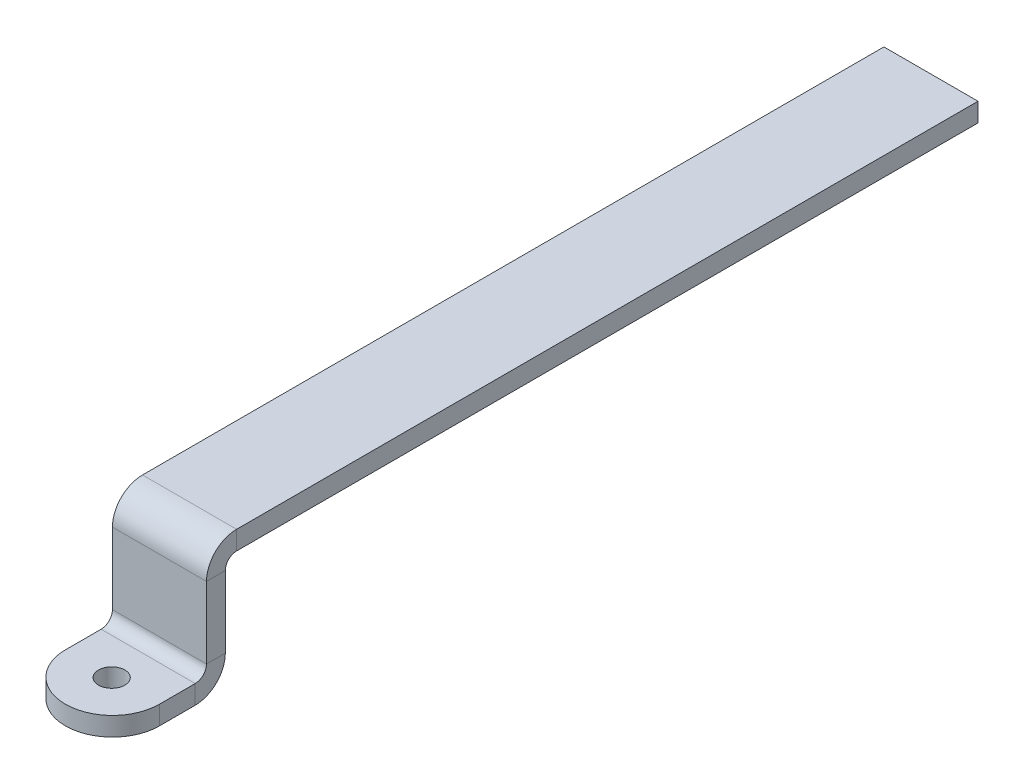
ISO-10303-21;
HEADER;
FILE_DESCRIPTION(('STEP AP214'),'2;1');
FILE_NAME('part.step','',(''),(''),'','','');
FILE_SCHEMA(('AUTOMOTIVE_DESIGN { 1 0 10303 214 1 1 1 1 }'));
ENDSEC;
DATA;
#1=APPLICATION_CONTEXT('core data for automotive mechanical design processes');
#2=APPLICATION_PROTOCOL_DEFINITION('international standard','automotive_design',2000,#1);
#3=PRODUCT_CONTEXT('',#1,'mechanical');
#4=PRODUCT('Part','Part','',(#3));
#5=PRODUCT_RELATED_PRODUCT_CATEGORY('part','',(#4));
#6=PRODUCT_DEFINITION_FORMATION('','',#4);
#7=PRODUCT_DEFINITION_CONTEXT('part definition',#1,'design');
#8=PRODUCT_DEFINITION('design','',#6,#7);
#9=PRODUCT_DEFINITION_SHAPE('','',#8);
#10=(LENGTH_UNIT() NAMED_UNIT(*) SI_UNIT(.MILLI.,.METRE.));
#11=(NAMED_UNIT(*) PLANE_ANGLE_UNIT() SI_UNIT($,.RADIAN.));
#12=(NAMED_UNIT(*) SI_UNIT($,.STERADIAN.) SOLID_ANGLE_UNIT());
#13=UNCERTAINTY_MEASURE_WITH_UNIT(LENGTH_MEASURE(1.E-05),#10,'distance_accuracy_value','');
#14=(GEOMETRIC_REPRESENTATION_CONTEXT(3) GLOBAL_UNCERTAINTY_ASSIGNED_CONTEXT((#13)) GLOBAL_UNIT_ASSIGNED_CONTEXT((#10,
#11,#12)) REPRESENTATION_CONTEXT('',''));
#15=CARTESIAN_POINT('',(0.,0.,0.));
#16=DIRECTION('',(0.,0.,1.));
#17=DIRECTION('',(1.,0.,0.));
#18=AXIS2_PLACEMENT_3D('',#15,#16,#17);
#19=CARTESIAN_POINT('',(0.,-1.25,0.875));
#20=DIRECTION('',(0.,1.,0.));
#21=DIRECTION('',(0.,0.,1.));
#22=AXIS2_PLACEMENT_3D('',#19,#20,#21);
#23=CYLINDRICAL_SURFACE('',#22,0.625);
#24=DIRECTION('',(0.,1.,0.));
#25=VECTOR('',#24,1.);
#26=CARTESIAN_POINT('',(0.625,-1.1,0.875));
#27=LINE('',#26,#25);
#28=CARTESIAN_POINT('',(0.625,-1.25,0.875));
#29=VERTEX_POINT('',#28);
#30=CARTESIAN_POINT('',(0.625,-1.5,0.875));
#31=VERTEX_POINT('',#30);
#32=EDGE_CURVE('E154',#29,#31,#27,.F.);
#33=ORIENTED_EDGE('',*,*,#32,.F.);
#34=CARTESIAN_POINT('',(0.,-1.25,0.875));
#35=DIRECTION('',(0.,-1.,0.));
#36=DIRECTION('',(0.,0.,-1.));
#37=AXIS2_PLACEMENT_3D('',#34,#35,#36);
#38=CIRCLE('',#37,0.625);
#39=CARTESIAN_POINT('',(-0.625,-1.25,0.875));
#40=VERTEX_POINT('',#39);
#41=EDGE_CURVE('E46',#40,#29,#38,.F.);
#42=ORIENTED_EDGE('',*,*,#41,.F.);
#43=DIRECTION('',(0.,-1.,0.));
#44=VECTOR('',#43,1.);
#45=CARTESIAN_POINT('',(-0.625,-1.25,0.875));
#46=LINE('',#45,#44);
#47=CARTESIAN_POINT('',(-0.625,-1.5,0.875));
#48=VERTEX_POINT('',#47);
#49=EDGE_CURVE('E250',#48,#40,#46,.F.);
#50=ORIENTED_EDGE('',*,*,#49,.F.);
#51=CARTESIAN_POINT('',(0.,-1.5,0.875));
#52=DIRECTION('',(0.,-1.,0.));
#53=DIRECTION('',(0.,0.,-1.));
#54=AXIS2_PLACEMENT_3D('',#51,#52,#53);
#55=CIRCLE('',#54,0.625);
#56=EDGE_CURVE('E11',#31,#48,#55,.T.);
#57=ORIENTED_EDGE('',*,*,#56,.F.);
#58=EDGE_LOOP('',(#33,#42,#50,#57));
#59=FACE_BOUND('',#58,.T.);
#60=ADVANCED_FACE('F38',(#59),#23,.T.);
#61=CARTESIAN_POINT('',(0.625,-0.15,0.));
#62=DIRECTION('',(1.,0.,0.));
#63=DIRECTION('',(0.,0.,-1.));
#64=AXIS2_PLACEMENT_3D('',#61,#62,#63);
#65=PLANE('',#64);
#66=DIRECTION('',(0.,0.,1.));
#67=VECTOR('',#66,1.);
#68=CARTESIAN_POINT('',(0.625,-0.15,0.));
#69=LINE('',#68,#67);
#70=CARTESIAN_POINT('',(0.625,-0.15,0.));
#71=VERTEX_POINT('',#70);
#72=CARTESIAN_POINT('',(0.625,-0.15,0.25));
#73=VERTEX_POINT('',#72);
#74=EDGE_CURVE('E247',#71,#73,#69,.T.);
#75=ORIENTED_EDGE('',*,*,#74,.F.);
#76=CARTESIAN_POINT('',(0.625,-0.15,-0.15));
#77=DIRECTION('',(-1.,0.,0.));
#78=DIRECTION('',(0.,0.,1.));
#79=AXIS2_PLACEMENT_3D('',#76,#77,#78);
#80=CIRCLE('',#79,0.15);
#81=CARTESIAN_POINT('',(0.625,0.,-0.150000000000001));
#82=VERTEX_POINT('',#81);
#83=EDGE_CURVE('E162',#82,#71,#80,.F.);
#84=ORIENTED_EDGE('',*,*,#83,.F.);
#85=DIRECTION('',(0.,-1.,0.));
#86=VECTOR('',#85,1.);
#87=CARTESIAN_POINT('',(0.625,0.25,-0.150000000000001));
#88=LINE('',#87,#86);
#89=CARTESIAN_POINT('',(0.625,0.25,-0.150000000000001));
#90=VERTEX_POINT('',#89);
#91=EDGE_CURVE('E245',#90,#82,#88,.T.);
#92=ORIENTED_EDGE('',*,*,#91,.F.);
#93=CARTESIAN_POINT('',(0.625,-0.15,-0.15));
#94=DIRECTION('',(1.,0.,0.));
#95=DIRECTION('',(0.,0.,-1.));
#96=AXIS2_PLACEMENT_3D('',#93,#94,#95);
#97=CIRCLE('',#96,0.4);
#98=EDGE_CURVE('E177',#90,#73,#97,.T.);
#99=ORIENTED_EDGE('',*,*,#98,.T.);
#100=EDGE_LOOP('',(#75,#84,#92,#99));
#101=FACE_BOUND('',#100,.T.);
#102=ADVANCED_FACE('F282',(#101),#65,.T.);
#103=CARTESIAN_POINT('',(0.625,0.25,-0.150000000000001));
#104=DIRECTION('',(1.,0.,0.));
#105=DIRECTION('',(0.,0.,-1.));
#106=AXIS2_PLACEMENT_3D('',#103,#104,#105);
#107=PLANE('',#106);
#108=DIRECTION('',(0.,-1.,0.));
#109=VECTOR('',#108,1.);
#110=CARTESIAN_POINT('',(0.625,0.,0.));
#111=LINE('',#110,#109);
#112=CARTESIAN_POINT('',(0.625,-1.1,0.));
#113=VERTEX_POINT('',#112);
#114=EDGE_CURVE('E160',#71,#113,#111,.T.);
#115=ORIENTED_EDGE('',*,*,#114,.F.);
#116=ORIENTED_EDGE('',*,*,#74,.T.);
#117=DIRECTION('',(0.,-1.,0.));
#118=VECTOR('',#117,1.);
#119=CARTESIAN_POINT('',(0.625,0.,0.25));
#120=LINE('',#119,#118);
#121=CARTESIAN_POINT('',(0.625,-1.1,0.25));
#122=VERTEX_POINT('',#121);
#123=EDGE_CURVE('E180',#73,#122,#120,.T.);
#124=ORIENTED_EDGE('',*,*,#123,.T.);
#125=DIRECTION('',(0.,0.,-1.));
#126=VECTOR('',#125,1.);
#127=CARTESIAN_POINT('',(0.625,-1.1,0.25));
#128=LINE('',#127,#126);
#129=EDGE_CURVE('E138',#122,#113,#128,.T.);
#130=ORIENTED_EDGE('',*,*,#129,.T.);
#131=EDGE_LOOP('',(#115,#116,#124,#130));
#132=FACE_BOUND('',#131,.T.);
#133=ADVANCED_FACE('F286',(#132),#107,.T.);
#134=CARTESIAN_POINT('',(-0.625,0.,-0.150000000000001));
#135=DIRECTION('',(-1.,0.,0.));
#136=DIRECTION('',(0.,0.,1.));
#137=AXIS2_PLACEMENT_3D('',#134,#135,#136);
#138=PLANE('',#137);
#139=DIRECTION('',(0.,1.,0.));
#140=VECTOR('',#139,1.);
#141=CARTESIAN_POINT('',(-0.625,0.,-0.150000000000001));
#142=LINE('',#141,#140);
#143=CARTESIAN_POINT('',(-0.625,0.,-0.150000000000001));
#144=VERTEX_POINT('',#143);
#145=CARTESIAN_POINT('',(-0.625,0.25,-0.150000000000001));
#146=VERTEX_POINT('',#145);
#147=EDGE_CURVE('E243',#144,#146,#142,.T.);
#148=ORIENTED_EDGE('',*,*,#147,.F.);
#149=CARTESIAN_POINT('',(-0.625,-0.15,-0.15));
#150=DIRECTION('',(-1.,0.,0.));
#151=DIRECTION('',(0.,0.,1.));
#152=AXIS2_PLACEMENT_3D('',#149,#150,#151);
#153=CIRCLE('',#152,0.15);
#154=CARTESIAN_POINT('',(-0.625,-0.15,0.));
#155=VERTEX_POINT('',#154);
#156=EDGE_CURVE('E195',#144,#155,#153,.F.);
#157=ORIENTED_EDGE('',*,*,#156,.T.);
#158=DIRECTION('',(0.,0.,-1.));
#159=VECTOR('',#158,1.);
#160=CARTESIAN_POINT('',(-0.625,-0.15,0.25));
#161=LINE('',#160,#159);
#162=CARTESIAN_POINT('',(-0.625,-0.15,0.25));
#163=VERTEX_POINT('',#162);
#164=EDGE_CURVE('E137',#163,#155,#161,.T.);
#165=ORIENTED_EDGE('',*,*,#164,.F.);
#166=CARTESIAN_POINT('',(-0.625,-0.15,-0.15));
#167=DIRECTION('',(1.,0.,0.));
#168=DIRECTION('',(0.,0.,-1.));
#169=AXIS2_PLACEMENT_3D('',#166,#167,#168);
#170=CIRCLE('',#169,0.4);
#171=EDGE_CURVE('E207',#146,#163,#170,.T.);
#172=ORIENTED_EDGE('',*,*,#171,.F.);
#173=EDGE_LOOP('',(#148,#157,#165,#172));
#174=FACE_BOUND('',#173,.T.);
#175=ADVANCED_FACE('F291',(#174),#138,.T.);
#176=CARTESIAN_POINT('',(-0.625,-0.15,0.25));
#177=DIRECTION('',(-1.,0.,0.));
#178=DIRECTION('',(0.,0.,1.));
#179=AXIS2_PLACEMENT_3D('',#176,#177,#178);
#180=PLANE('',#179);
#181=DIRECTION('',(0.,0.,1.));
#182=VECTOR('',#181,1.);
#183=CARTESIAN_POINT('',(-0.625,0.,-10.));
#184=LINE('',#183,#182);
#185=CARTESIAN_POINT('',(-0.625,0.,-10.));
#186=VERTEX_POINT('',#185);
#187=EDGE_CURVE('E198',#186,#144,#184,.T.);
#188=ORIENTED_EDGE('',*,*,#187,.T.);
#189=ORIENTED_EDGE('',*,*,#147,.T.);
#190=DIRECTION('',(0.,0.,1.));
#191=VECTOR('',#190,1.);
#192=CARTESIAN_POINT('',(-0.625,0.25,-10.));
#193=LINE('',#192,#191);
#194=CARTESIAN_POINT('',(-0.625,0.25,-10.));
#195=VERTEX_POINT('',#194);
#196=EDGE_CURVE('E204',#195,#146,#193,.T.);
#197=ORIENTED_EDGE('',*,*,#196,.F.);
#198=DIRECTION('',(0.,-1.,0.));
#199=VECTOR('',#198,1.);
#200=CARTESIAN_POINT('',(-0.625,0.25,-10.));
#201=LINE('',#200,#199);
#202=EDGE_CURVE('E201',#195,#186,#201,.T.);
#203=ORIENTED_EDGE('',*,*,#202,.T.);
#204=EDGE_LOOP('',(#188,#189,#197,#203));
#205=FACE_BOUND('',#204,.T.);
#206=ADVANCED_FACE('F297',(#205),#180,.T.);
#207=CARTESIAN_POINT('',(0.625,-1.5,0.4));
#208=DIRECTION('',(1.,0.,0.));
#209=DIRECTION('',(0.,0.,-1.));
#210=AXIS2_PLACEMENT_3D('',#207,#208,#209);
#211=PLANE('',#210);
#212=DIRECTION('',(0.,1.,0.));
#213=VECTOR('',#212,1.);
#214=CARTESIAN_POINT('',(0.625,-1.5,0.4));
#215=LINE('',#214,#213);
#216=CARTESIAN_POINT('',(0.625,-1.5,0.4));
#217=VERTEX_POINT('',#216);
#218=CARTESIAN_POINT('',(0.625,-1.25,0.4));
#219=VERTEX_POINT('',#218);
#220=EDGE_CURVE('E125',#217,#219,#215,.T.);
#221=ORIENTED_EDGE('',*,*,#220,.F.);
#222=CARTESIAN_POINT('',(0.625,-1.1,0.4));
#223=DIRECTION('',(1.,0.,0.));
#224=DIRECTION('',(0.,0.,-1.));
#225=AXIS2_PLACEMENT_3D('',#222,#223,#224);
#226=CIRCLE('',#225,0.4);
#227=EDGE_CURVE('E129',#113,#217,#226,.F.);
#228=ORIENTED_EDGE('',*,*,#227,.F.);
#229=ORIENTED_EDGE('',*,*,#129,.F.);
#230=CARTESIAN_POINT('',(0.625,-1.1,0.4));
#231=DIRECTION('',(1.,0.,0.));
#232=DIRECTION('',(0.,0.,-1.));
#233=AXIS2_PLACEMENT_3D('',#230,#231,#232);
#234=CIRCLE('',#233,0.15);
#235=EDGE_CURVE('E132',#122,#219,#234,.F.);
#236=ORIENTED_EDGE('',*,*,#235,.T.);
#237=EDGE_LOOP('',(#221,#228,#229,#236));
#238=FACE_BOUND('',#237,.T.);
#239=ADVANCED_FACE('F127',(#238),#211,.T.);
#240=CARTESIAN_POINT('',(0.625,-1.1,0.25));
#241=DIRECTION('',(1.,0.,0.));
#242=DIRECTION('',(0.,0.,-1.));
#243=AXIS2_PLACEMENT_3D('',#240,#241,#242);
#244=PLANE('',#243);
#245=DIRECTION('',(0.,0.,1.));
#246=VECTOR('',#245,1.);
#247=CARTESIAN_POINT('',(0.625,-1.25,0.));
#248=LINE('',#247,#246);
#249=EDGE_CURVE('E155',#219,#29,#248,.T.);
#250=ORIENTED_EDGE('',*,*,#249,.T.);
#251=ORIENTED_EDGE('',*,*,#32,.T.);
#252=DIRECTION('',(0.,0.,1.));
#253=VECTOR('',#252,1.);
#254=CARTESIAN_POINT('',(0.625,-1.5,0.));
#255=LINE('',#254,#253);
#256=EDGE_CURVE('E143',#217,#31,#255,.T.);
#257=ORIENTED_EDGE('',*,*,#256,.F.);
#258=ORIENTED_EDGE('',*,*,#220,.T.);
#259=EDGE_LOOP('',(#250,#251,#257,#258));
#260=FACE_BOUND('',#259,.T.);
#261=ADVANCED_FACE('F153',(#260),#244,.T.);
#262=CARTESIAN_POINT('',(-0.625,-1.1,0.));
#263=DIRECTION('',(-1.,0.,0.));
#264=DIRECTION('',(0.,0.,1.));
#265=AXIS2_PLACEMENT_3D('',#262,#263,#264);
#266=PLANE('',#265);
#267=DIRECTION('',(0.,0.,1.));
#268=VECTOR('',#267,1.);
#269=CARTESIAN_POINT('',(-0.625,-1.1,0.));
#270=LINE('',#269,#268);
#271=CARTESIAN_POINT('',(-0.625,-1.1,0.));
#272=VERTEX_POINT('',#271);
#273=CARTESIAN_POINT('',(-0.625,-1.1,0.25));
#274=VERTEX_POINT('',#273);
#275=EDGE_CURVE('E239',#272,#274,#270,.T.);
#276=ORIENTED_EDGE('',*,*,#275,.F.);
#277=CARTESIAN_POINT('',(-0.625,-1.1,0.4));
#278=DIRECTION('',(1.,0.,0.));
#279=DIRECTION('',(0.,0.,-1.));
#280=AXIS2_PLACEMENT_3D('',#277,#278,#279);
#281=CIRCLE('',#280,0.4);
#282=CARTESIAN_POINT('',(-0.625,-1.5,0.4));
#283=VERTEX_POINT('',#282);
#284=EDGE_CURVE('E190',#272,#283,#281,.F.);
#285=ORIENTED_EDGE('',*,*,#284,.T.);
#286=DIRECTION('',(0.,-1.,0.));
#287=VECTOR('',#286,1.);
#288=CARTESIAN_POINT('',(-0.625,-1.25,0.4));
#289=LINE('',#288,#287);
#290=CARTESIAN_POINT('',(-0.625,-1.25,0.4));
#291=VERTEX_POINT('',#290);
#292=EDGE_CURVE('E149',#291,#283,#289,.T.);
#293=ORIENTED_EDGE('',*,*,#292,.F.);
#294=CARTESIAN_POINT('',(-0.625,-1.1,0.4));
#295=DIRECTION('',(1.,0.,0.));
#296=DIRECTION('',(0.,0.,-1.));
#297=AXIS2_PLACEMENT_3D('',#294,#295,#296);
#298=CIRCLE('',#297,0.15);
#299=EDGE_CURVE('E213',#274,#291,#298,.F.);
#300=ORIENTED_EDGE('',*,*,#299,.F.);
#301=EDGE_LOOP('',(#276,#285,#293,#300));
#302=FACE_BOUND('',#301,.T.);
#303=ADVANCED_FACE('F278',(#302),#266,.T.);
#304=CARTESIAN_POINT('',(-0.625,-1.25,0.4));
#305=DIRECTION('',(-1.,0.,0.));
#306=DIRECTION('',(0.,0.,1.));
#307=AXIS2_PLACEMENT_3D('',#304,#305,#306);
#308=PLANE('',#307);
#309=DIRECTION('',(0.,-1.,0.));
#310=VECTOR('',#309,1.);
#311=CARTESIAN_POINT('',(-0.625,0.,0.));
#312=LINE('',#311,#310);
#313=EDGE_CURVE('E192',#155,#272,#312,.T.);
#314=ORIENTED_EDGE('',*,*,#313,.T.);
#315=ORIENTED_EDGE('',*,*,#275,.T.);
#316=DIRECTION('',(0.,-1.,0.));
#317=VECTOR('',#316,1.);
#318=CARTESIAN_POINT('',(-0.625,0.,0.25));
#319=LINE('',#318,#317);
#320=EDGE_CURVE('E210',#163,#274,#319,.T.);
#321=ORIENTED_EDGE('',*,*,#320,.F.);
#322=ORIENTED_EDGE('',*,*,#164,.T.);
#323=EDGE_LOOP('',(#314,#315,#321,#322));
#324=FACE_BOUND('',#323,.T.);
#325=ADVANCED_FACE('F271',(#324),#308,.T.);
#326=CARTESIAN_POINT('',(0.625,-1.25,0.));
#327=DIRECTION('',(0.,-1.,0.));
#328=DIRECTION('',(0.,0.,-1.));
#329=AXIS2_PLACEMENT_3D('',#326,#327,#328);
#330=PLANE('',#329);
#331=CARTESIAN_POINT('',(0.00147138158428962,-1.25,0.886025874251898));
#332=DIRECTION('',(0.,1.,0.));
#333=DIRECTION('',(0.,0.,1.));
#334=AXIS2_PLACEMENT_3D('',#331,#332,#333);
#335=CIRCLE('',#334,0.175);
#336=CARTESIAN_POINT('',(0.00147138158428962,-1.25,1.0610258742519));
#337=VERTEX_POINT('',#336);
#338=EDGE_CURVE('E256',#337,#337,#335,.T.);
#339=ORIENTED_EDGE('',*,*,#338,.F.);
#340=EDGE_LOOP('',(#339));
#341=FACE_BOUND('',#340,.T.);
#342=DIRECTION('',(0.,0.,1.));
#343=VECTOR('',#342,1.);
#344=CARTESIAN_POINT('',(-0.625,-1.25,0.));
#345=LINE('',#344,#343);
#346=EDGE_CURVE('E185',#291,#40,#345,.T.);
#347=ORIENTED_EDGE('',*,*,#346,.T.);
#348=ORIENTED_EDGE('',*,*,#41,.T.);
#349=ORIENTED_EDGE('',*,*,#249,.F.);
#350=DIRECTION('',(-1.,0.,0.));
#351=VECTOR('',#350,1.);
#352=CARTESIAN_POINT('',(0.625,-1.25,0.4));
#353=LINE('',#352,#351);
#354=EDGE_CURVE('E184',#219,#291,#353,.T.);
#355=ORIENTED_EDGE('',*,*,#354,.T.);
#356=EDGE_LOOP('',(#347,#348,#349,#355));
#357=FACE_BOUND('',#356,.T.);
#358=ADVANCED_FACE('F253',(#341,#357),#330,.F.);
#359=CARTESIAN_POINT('',(0.625,-1.5,0.));
#360=DIRECTION('',(0.,-1.,0.));
#361=DIRECTION('',(0.,0.,-1.));
#362=AXIS2_PLACEMENT_3D('',#359,#360,#361);
#363=PLANE('',#362);
#364=CARTESIAN_POINT('',(0.00147138158428962,-1.5,0.886025874251898));
#365=DIRECTION('',(0.,1.,0.));
#366=DIRECTION('',(0.,0.,1.));
#367=AXIS2_PLACEMENT_3D('',#364,#365,#366);
#368=CIRCLE('',#367,0.175);
#369=CARTESIAN_POINT('',(0.00147138158428962,-1.5,1.0610258742519));
#370=VERTEX_POINT('',#369);
#371=EDGE_CURVE('E188',#370,#370,#368,.T.);
#372=ORIENTED_EDGE('',*,*,#371,.T.);
#373=EDGE_LOOP('',(#372));
#374=FACE_BOUND('',#373,.T.);
#375=ORIENTED_EDGE('',*,*,#256,.T.);
#376=ORIENTED_EDGE('',*,*,#56,.T.);
#377=DIRECTION('',(0.,0.,1.));
#378=VECTOR('',#377,1.);
#379=CARTESIAN_POINT('',(-0.625,-1.5,0.));
#380=LINE('',#379,#378);
#381=EDGE_CURVE('E145',#283,#48,#380,.T.);
#382=ORIENTED_EDGE('',*,*,#381,.F.);
#383=DIRECTION('',(-1.,0.,0.));
#384=VECTOR('',#383,1.);
#385=CARTESIAN_POINT('',(0.625,-1.5,0.4));
#386=LINE('',#385,#384);
#387=EDGE_CURVE('E141',#217,#283,#386,.T.);
#388=ORIENTED_EDGE('',*,*,#387,.F.);
#389=EDGE_LOOP('',(#375,#376,#382,#388));
#390=FACE_BOUND('',#389,.T.);
#391=ADVANCED_FACE('F142',(#374,#390),#363,.T.);
#392=CARTESIAN_POINT('',(0.625,-1.1,0.4));
#393=DIRECTION('',(-1.,0.,0.));
#394=DIRECTION('',(0.,0.,1.));
#395=AXIS2_PLACEMENT_3D('',#392,#393,#394);
#396=CYLINDRICAL_SURFACE('',#395,0.4);
#397=ORIENTED_EDGE('',*,*,#284,.F.);
#398=DIRECTION('',(-1.,0.,0.));
#399=VECTOR('',#398,1.);
#400=CARTESIAN_POINT('',(0.625,-1.1,0.));
#401=LINE('',#400,#399);
#402=EDGE_CURVE('E150',#113,#272,#401,.T.);
#403=ORIENTED_EDGE('',*,*,#402,.F.);
#404=ORIENTED_EDGE('',*,*,#227,.T.);
#405=ORIENTED_EDGE('',*,*,#387,.T.);
#406=EDGE_LOOP('',(#397,#403,#404,#405));
#407=FACE_BOUND('',#406,.T.);
#408=ADVANCED_FACE('F158',(#407),#396,.T.);
#409=CARTESIAN_POINT('',(0.625,0.,0.));
#410=DIRECTION('',(0.,0.,-1.));
#411=DIRECTION('',(0.,1.,0.));
#412=AXIS2_PLACEMENT_3D('',#409,#410,#411);
#413=PLANE('',#412);
#414=ORIENTED_EDGE('',*,*,#313,.F.);
#415=DIRECTION('',(-1.,0.,0.));
#416=VECTOR('',#415,1.);
#417=CARTESIAN_POINT('',(0.625,-0.15,0.));
#418=LINE('',#417,#416);
#419=EDGE_CURVE('E234',#71,#155,#418,.T.);
#420=ORIENTED_EDGE('',*,*,#419,.F.);
#421=ORIENTED_EDGE('',*,*,#114,.T.);
#422=ORIENTED_EDGE('',*,*,#402,.T.);
#423=EDGE_LOOP('',(#414,#420,#421,#422));
#424=FACE_BOUND('',#423,.T.);
#425=ADVANCED_FACE('F314',(#424),#413,.T.);
#426=CARTESIAN_POINT('',(0.625,-0.15,-0.15));
#427=DIRECTION('',(-1.,0.,0.));
#428=DIRECTION('',(0.,0.,1.));
#429=AXIS2_PLACEMENT_3D('',#426,#427,#428);
#430=CYLINDRICAL_SURFACE('',#429,0.15);
#431=ORIENTED_EDGE('',*,*,#156,.F.);
#432=DIRECTION('',(-1.,0.,0.));
#433=VECTOR('',#432,1.);
#434=CARTESIAN_POINT('',(0.625,0.,-0.150000000000001));
#435=LINE('',#434,#433);
#436=EDGE_CURVE('E231',#82,#144,#435,.T.);
#437=ORIENTED_EDGE('',*,*,#436,.F.);
#438=ORIENTED_EDGE('',*,*,#83,.T.);
#439=ORIENTED_EDGE('',*,*,#419,.T.);
#440=EDGE_LOOP('',(#431,#437,#438,#439));
#441=FACE_BOUND('',#440,.T.);
#442=ADVANCED_FACE('F320',(#441),#430,.F.);
#443=CARTESIAN_POINT('',(0.625,0.,-10.));
#444=DIRECTION('',(0.,-1.,0.));
#445=DIRECTION('',(0.,0.,-1.));
#446=AXIS2_PLACEMENT_3D('',#443,#444,#445);
#447=PLANE('',#446);
#448=ORIENTED_EDGE('',*,*,#187,.F.);
#449=DIRECTION('',(-1.,0.,0.));
#450=VECTOR('',#449,1.);
#451=CARTESIAN_POINT('',(0.625,0.,-10.));
#452=LINE('',#451,#450);
#453=CARTESIAN_POINT('',(0.625,0.,-10.));
#454=VERTEX_POINT('',#453);
#455=EDGE_CURVE('E229',#454,#186,#452,.T.);
#456=ORIENTED_EDGE('',*,*,#455,.F.);
#457=DIRECTION('',(0.,0.,1.));
#458=VECTOR('',#457,1.);
#459=CARTESIAN_POINT('',(0.625,0.,-10.));
#460=LINE('',#459,#458);
#461=EDGE_CURVE('E168',#454,#82,#460,.T.);
#462=ORIENTED_EDGE('',*,*,#461,.T.);
#463=ORIENTED_EDGE('',*,*,#436,.T.);
#464=EDGE_LOOP('',(#448,#456,#462,#463));
#465=FACE_BOUND('',#464,.T.);
#466=ADVANCED_FACE('F354',(#465),#447,.T.);
#467=CARTESIAN_POINT('',(0.625,0.25,-10.));
#468=DIRECTION('',(0.,0.,-1.));
#469=DIRECTION('',(-1.,0.,0.));
#470=AXIS2_PLACEMENT_3D('',#467,#468,#469);
#471=PLANE('',#470);
#472=ORIENTED_EDGE('',*,*,#202,.F.);
#473=DIRECTION('',(-1.,0.,0.));
#474=VECTOR('',#473,1.);
#475=CARTESIAN_POINT('',(0.625,0.25,-10.));
#476=LINE('',#475,#474);
#477=CARTESIAN_POINT('',(0.625,0.25,-10.));
#478=VERTEX_POINT('',#477);
#479=EDGE_CURVE('E227',#478,#195,#476,.T.);
#480=ORIENTED_EDGE('',*,*,#479,.F.);
#481=DIRECTION('',(0.,-1.,0.));
#482=VECTOR('',#481,1.);
#483=CARTESIAN_POINT('',(0.625,0.25,-10.));
#484=LINE('',#483,#482);
#485=EDGE_CURVE('E171',#478,#454,#484,.T.);
#486=ORIENTED_EDGE('',*,*,#485,.T.);
#487=ORIENTED_EDGE('',*,*,#455,.T.);
#488=EDGE_LOOP('',(#472,#480,#486,#487));
#489=FACE_BOUND('',#488,.T.);
#490=ADVANCED_FACE('F350',(#489),#471,.T.);
#491=CARTESIAN_POINT('',(0.625,0.25,-10.));
#492=DIRECTION('',(0.,-1.,0.));
#493=DIRECTION('',(0.,0.,-1.));
#494=AXIS2_PLACEMENT_3D('',#491,#492,#493);
#495=PLANE('',#494);
#496=ORIENTED_EDGE('',*,*,#196,.T.);
#497=DIRECTION('',(-1.,0.,0.));
#498=VECTOR('',#497,1.);
#499=CARTESIAN_POINT('',(0.625,0.25,-0.150000000000001));
#500=LINE('',#499,#498);
#501=EDGE_CURVE('E224',#90,#146,#500,.T.);
#502=ORIENTED_EDGE('',*,*,#501,.F.);
#503=DIRECTION('',(0.,0.,1.));
#504=VECTOR('',#503,1.);
#505=CARTESIAN_POINT('',(0.625,0.25,-10.));
#506=LINE('',#505,#504);
#507=EDGE_CURVE('E174',#478,#90,#506,.T.);
#508=ORIENTED_EDGE('',*,*,#507,.F.);
#509=ORIENTED_EDGE('',*,*,#479,.T.);
#510=EDGE_LOOP('',(#496,#502,#508,#509));
#511=FACE_BOUND('',#510,.T.);
#512=ADVANCED_FACE('F346',(#511),#495,.F.);
#513=CARTESIAN_POINT('',(0.625,-0.15,-0.15));
#514=DIRECTION('',(-1.,0.,0.));
#515=DIRECTION('',(0.,0.,1.));
#516=AXIS2_PLACEMENT_3D('',#513,#514,#515);
#517=CYLINDRICAL_SURFACE('',#516,0.4);
#518=ORIENTED_EDGE('',*,*,#171,.T.);
#519=DIRECTION('',(-1.,0.,0.));
#520=VECTOR('',#519,1.);
#521=CARTESIAN_POINT('',(0.625,-0.15,0.25));
#522=LINE('',#521,#520);
#523=EDGE_CURVE('E221',#73,#163,#522,.T.);
#524=ORIENTED_EDGE('',*,*,#523,.F.);
#525=ORIENTED_EDGE('',*,*,#98,.F.);
#526=ORIENTED_EDGE('',*,*,#501,.T.);
#527=EDGE_LOOP('',(#518,#524,#525,#526));
#528=FACE_BOUND('',#527,.T.);
#529=ADVANCED_FACE('F343',(#528),#517,.T.);
#530=CARTESIAN_POINT('',(0.625,0.,0.25));
#531=DIRECTION('',(0.,0.,-1.));
#532=DIRECTION('',(0.,1.,0.));
#533=AXIS2_PLACEMENT_3D('',#530,#531,#532);
#534=PLANE('',#533);
#535=ORIENTED_EDGE('',*,*,#320,.T.);
#536=DIRECTION('',(-1.,0.,0.));
#537=VECTOR('',#536,1.);
#538=CARTESIAN_POINT('',(0.625,-1.1,0.25));
#539=LINE('',#538,#537);
#540=EDGE_CURVE('E218',#122,#274,#539,.T.);
#541=ORIENTED_EDGE('',*,*,#540,.F.);
#542=ORIENTED_EDGE('',*,*,#123,.F.);
#543=ORIENTED_EDGE('',*,*,#523,.T.);
#544=EDGE_LOOP('',(#535,#541,#542,#543));
#545=FACE_BOUND('',#544,.T.);
#546=ADVANCED_FACE('F326',(#545),#534,.F.);
#547=CARTESIAN_POINT('',(0.625,-1.1,0.4));
#548=DIRECTION('',(-1.,0.,0.));
#549=DIRECTION('',(0.,0.,1.));
#550=AXIS2_PLACEMENT_3D('',#547,#548,#549);
#551=CYLINDRICAL_SURFACE('',#550,0.15);
#552=ORIENTED_EDGE('',*,*,#299,.T.);
#553=ORIENTED_EDGE('',*,*,#354,.F.);
#554=ORIENTED_EDGE('',*,*,#235,.F.);
#555=ORIENTED_EDGE('',*,*,#540,.T.);
#556=EDGE_LOOP('',(#552,#553,#554,#555));
#557=FACE_BOUND('',#556,.T.);
#558=ADVANCED_FACE('F328',(#557),#551,.F.);
#559=CARTESIAN_POINT('',(0.625,-1.1,0.4));
#560=DIRECTION('',(1.,0.,0.));
#561=DIRECTION('',(0.,0.,-1.));
#562=AXIS2_PLACEMENT_3D('',#559,#560,#561);
#563=PLANE('',#562);
#564=ORIENTED_EDGE('',*,*,#507,.T.);
#565=ORIENTED_EDGE('',*,*,#91,.T.);
#566=ORIENTED_EDGE('',*,*,#461,.F.);
#567=ORIENTED_EDGE('',*,*,#485,.F.);
#568=EDGE_LOOP('',(#564,#565,#566,#567));
#569=FACE_BOUND('',#568,.T.);
#570=ADVANCED_FACE('F331',(#569),#563,.T.);
#571=CARTESIAN_POINT('',(-0.625,-1.1,0.4));
#572=DIRECTION('',(1.,0.,0.));
#573=DIRECTION('',(0.,0.,-1.));
#574=AXIS2_PLACEMENT_3D('',#571,#572,#573);
#575=PLANE('',#574);
#576=ORIENTED_EDGE('',*,*,#381,.T.);
#577=ORIENTED_EDGE('',*,*,#49,.T.);
#578=ORIENTED_EDGE('',*,*,#346,.F.);
#579=ORIENTED_EDGE('',*,*,#292,.T.);
#580=EDGE_LOOP('',(#576,#577,#578,#579));
#581=FACE_BOUND('',#580,.T.);
#582=ADVANCED_FACE('F266',(#581),#575,.F.);
#583=CARTESIAN_POINT('',(0.00147138158428962,-1.5,0.886025874251898));
#584=DIRECTION('',(0.,1.,0.));
#585=DIRECTION('',(0.,0.,1.));
#586=AXIS2_PLACEMENT_3D('',#583,#584,#585);
#587=CYLINDRICAL_SURFACE('',#586,0.175);
#588=ORIENTED_EDGE('',*,*,#371,.F.);
#589=EDGE_LOOP('',(#588));
#590=FACE_BOUND('',#589,.T.);
#591=ORIENTED_EDGE('',*,*,#338,.T.);
#592=EDGE_LOOP('',(#591));
#593=FACE_BOUND('',#592,.T.);
#594=ADVANCED_FACE('F263',(#590,#593),#587,.F.);
#595=CLOSED_SHELL('',(#60,#102,#133,#175,#206,#239,#261,#303,#325,#358,#391,#408,#425,#442,#466,
#490,#512,#529,#546,#558,#570,#582,#594));
#596=MANIFOLD_SOLID_BREP('B2',#595);
#597=ADVANCED_BREP_SHAPE_REPRESENTATION('',(#18,#596),#14);
#598=SHAPE_DEFINITION_REPRESENTATION(#9,#597);
ENDSEC;
END-ISO-10303-21;
